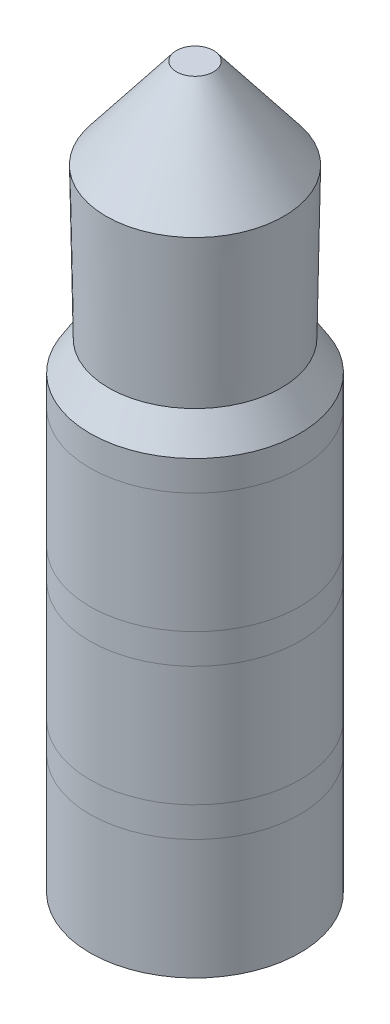
ISO-10303-21;
HEADER;
FILE_DESCRIPTION(('STEP AP214'),'2;1');
FILE_NAME('part.step','',(''),(''),'','','');
FILE_SCHEMA(('AUTOMOTIVE_DESIGN { 1 0 10303 214 1 1 1 1 }'));
ENDSEC;
DATA;
#1=APPLICATION_CONTEXT('core data for automotive mechanical design processes');
#2=APPLICATION_PROTOCOL_DEFINITION('international standard','automotive_design',2000,#1);
#3=PRODUCT_CONTEXT('',#1,'mechanical');
#4=PRODUCT('Part','Part','',(#3));
#5=PRODUCT_RELATED_PRODUCT_CATEGORY('part','',(#4));
#6=PRODUCT_DEFINITION_FORMATION('','',#4);
#7=PRODUCT_DEFINITION_CONTEXT('part definition',#1,'design');
#8=PRODUCT_DEFINITION('design','',#6,#7);
#9=PRODUCT_DEFINITION_SHAPE('','',#8);
#10=(LENGTH_UNIT() NAMED_UNIT(*) SI_UNIT(.MILLI.,.METRE.));
#11=(NAMED_UNIT(*) PLANE_ANGLE_UNIT() SI_UNIT($,.RADIAN.));
#12=(NAMED_UNIT(*) SI_UNIT($,.STERADIAN.) SOLID_ANGLE_UNIT());
#13=UNCERTAINTY_MEASURE_WITH_UNIT(LENGTH_MEASURE(1.E-05),#10,'distance_accuracy_value','');
#14=(GEOMETRIC_REPRESENTATION_CONTEXT(3) GLOBAL_UNCERTAINTY_ASSIGNED_CONTEXT((#13)) GLOBAL_UNIT_ASSIGNED_CONTEXT((#10,
#11,#12)) REPRESENTATION_CONTEXT('',''));
#15=CARTESIAN_POINT('',(0.,0.,0.));
#16=DIRECTION('',(0.,0.,1.));
#17=DIRECTION('',(1.,0.,0.));
#18=AXIS2_PLACEMENT_3D('',#15,#16,#17);
#19=CARTESIAN_POINT('',(0.,7.5,0.));
#20=DIRECTION('',(0.,-1.,0.));
#21=DIRECTION('',(0.,0.,1.));
#22=AXIS2_PLACEMENT_3D('',#19,#20,#21);
#23=CONICAL_SURFACE('',#22,1.75,0.558505360638186);
#24=CARTESIAN_POINT('',(0.,8.,0.));
#25=DIRECTION('',(0.,1.,0.));
#26=DIRECTION('',(0.,0.,1.));
#27=AXIS2_PLACEMENT_3D('',#24,#25,#26);
#28=CIRCLE('',#27,1.43756532404534);
#29=CARTESIAN_POINT('',(0.,8.,1.43756532404534));
#30=VERTEX_POINT('',#29);
#31=EDGE_CURVE('E11',#30,#30,#28,.T.);
#32=ORIENTED_EDGE('',*,*,#31,.F.);
#33=EDGE_LOOP('',(#32));
#34=FACE_BOUND('',#33,.T.);
#35=CARTESIAN_POINT('',(0.,7.5,0.));
#36=DIRECTION('',(0.,1.,0.));
#37=DIRECTION('',(0.,0.,1.));
#38=AXIS2_PLACEMENT_3D('',#35,#36,#37);
#39=CIRCLE('',#38,1.75);
#40=CARTESIAN_POINT('',(0.,7.5,1.75));
#41=VERTEX_POINT('',#40);
#42=EDGE_CURVE('E50',#41,#41,#39,.T.);
#43=ORIENTED_EDGE('',*,*,#42,.T.);
#44=EDGE_LOOP('',(#43));
#45=FACE_BOUND('',#44,.T.);
#46=ADVANCED_FACE('F44',(#34,#45),#23,.T.);
#47=CARTESIAN_POINT('',(0.,7.5,0.));
#48=DIRECTION('',(0.,1.,0.));
#49=DIRECTION('',(0.,0.,1.));
#50=AXIS2_PLACEMENT_3D('',#47,#48,#49);
#51=PLANE('',#50);
#52=ORIENTED_EDGE('',*,*,#42,.F.);
#53=EDGE_LOOP('',(#52));
#54=FACE_BOUND('',#53,.T.);
#55=ADVANCED_FACE('F74',(#54),#51,.F.);
#56=CARTESIAN_POINT('',(0.,8.,0.));
#57=DIRECTION('',(0.,1.,0.));
#58=DIRECTION('',(0.,0.,1.));
#59=AXIS2_PLACEMENT_3D('',#56,#57,#58);
#60=CONICAL_SURFACE('',#59,1.43756532404534,0.0174532925199435);
#61=CARTESIAN_POINT('',(0.,10.5,0.));
#62=DIRECTION('',(0.,1.,0.));
#63=DIRECTION('',(0.,0.,1.));
#64=AXIS2_PLACEMENT_3D('',#61,#62,#63);
#65=CIRCLE('',#64,1.48120298636588);
#66=CARTESIAN_POINT('',(0.,10.5,1.48120298636588));
#67=VERTEX_POINT('',#66);
#68=EDGE_CURVE('E54',#67,#67,#65,.T.);
#69=ORIENTED_EDGE('',*,*,#68,.F.);
#70=EDGE_LOOP('',(#69));
#71=FACE_BOUND('',#70,.T.);
#72=ORIENTED_EDGE('',*,*,#31,.T.);
#73=EDGE_LOOP('',(#72));
#74=FACE_BOUND('',#73,.T.);
#75=ADVANCED_FACE('F69',(#71,#74),#60,.T.);
#76=CARTESIAN_POINT('',(0.,10.5,0.));
#77=DIRECTION('',(0.,-1.,0.));
#78=DIRECTION('',(0.,0.,1.));
#79=AXIS2_PLACEMENT_3D('',#76,#77,#78);
#80=CONICAL_SURFACE('',#79,1.48120298636588,0.663225115757846);
#81=CARTESIAN_POINT('',(0.,12.,0.));
#82=DIRECTION('',(0.,1.,0.));
#83=DIRECTION('',(0.,0.,1.));
#84=AXIS2_PLACEMENT_3D('',#81,#82,#83);
#85=CIRCLE('',#84,0.309274546605803);
#86=CARTESIAN_POINT('',(0.,12.,0.309274546605803));
#87=VERTEX_POINT('',#86);
#88=EDGE_CURVE('E58',#87,#87,#85,.T.);
#89=CARTESIAN_POINT('',(0.,12.,0.309274546605803));
#90=CARTESIAN_POINT('',(0.,11.984375,0.321482134519972));
#91=CARTESIAN_POINT('',(0.,11.96875,0.333689722434139));
#92=CARTESIAN_POINT('',(0.,11.9375,0.358104898262473));
#93=CARTESIAN_POINT('',(0.,11.921875,0.370312486176641));
#94=CARTESIAN_POINT('',(0.,11.890625,0.394727662004975));
#95=CARTESIAN_POINT('',(0.,11.875,0.406935249919143));
#96=CARTESIAN_POINT('',(0.,11.84375,0.431350425747478));
#97=CARTESIAN_POINT('',(0.,11.828125,0.443558013661646));
#98=CARTESIAN_POINT('',(0.,11.796875,0.46797318948998));
#99=CARTESIAN_POINT('',(0.,11.78125,0.480180777404148));
#100=CARTESIAN_POINT('',(0.,11.75,0.504595953232483));
#101=CARTESIAN_POINT('',(0.,11.734375,0.51680354114665));
#102=CARTESIAN_POINT('',(0.,11.703125,0.541218716974985));
#103=CARTESIAN_POINT('',(0.,11.6875,0.553426304889153));
#104=CARTESIAN_POINT('',(0.,11.65625,0.577841480717488));
#105=CARTESIAN_POINT('',(0.,11.640625,0.590049068631655));
#106=CARTESIAN_POINT('',(0.,11.609375,0.61446424445999));
#107=CARTESIAN_POINT('',(0.,11.59375,0.626671832374158));
#108=CARTESIAN_POINT('',(0.,11.5625,0.651087008202493));
#109=CARTESIAN_POINT('',(0.,11.546875,0.66329459611666));
#110=CARTESIAN_POINT('',(0.,11.515625,0.687709771944995));
#111=CARTESIAN_POINT('',(0.,11.5,0.699917359859162));
#112=CARTESIAN_POINT('',(0.,11.46875,0.724332535687497));
#113=CARTESIAN_POINT('',(0.,11.453125,0.736540123601665));
#114=CARTESIAN_POINT('',(0.,11.421875,0.76095529943));
#115=CARTESIAN_POINT('',(0.,11.40625,0.773162887344167));
#116=CARTESIAN_POINT('',(0.,11.375,0.797578063172502));
#117=CARTESIAN_POINT('',(0.,11.359375,0.80978565108667));
#118=CARTESIAN_POINT('',(0.,11.328125,0.834200826915005));
#119=CARTESIAN_POINT('',(0.,11.3125,0.846408414829172));
#120=CARTESIAN_POINT('',(0.,11.28125,0.870823590657507));
#121=CARTESIAN_POINT('',(0.,11.265625,0.883031178571675));
#122=CARTESIAN_POINT('',(0.,11.234375,0.90744635440001));
#123=CARTESIAN_POINT('',(0.,11.21875,0.919653942314177));
#124=CARTESIAN_POINT('',(0.,11.1875,0.944069118142512));
#125=CARTESIAN_POINT('',(0.,11.171875,0.956276706056679));
#126=CARTESIAN_POINT('',(0.,11.140625,0.980691881885014));
#127=CARTESIAN_POINT('',(0.,11.125,0.992899469799182));
#128=CARTESIAN_POINT('',(0.,11.09375,1.01731464562752));
#129=CARTESIAN_POINT('',(0.,11.078125,1.02952223354168));
#130=CARTESIAN_POINT('',(0.,11.046875,1.05393740937002));
#131=CARTESIAN_POINT('',(0.,11.03125,1.06614499728419));
#132=CARTESIAN_POINT('',(0.,11.,1.09056017311252));
#133=CARTESIAN_POINT('',(0.,10.984375,1.10276776102669));
#134=CARTESIAN_POINT('',(0.,10.953125,1.12718293685502));
#135=CARTESIAN_POINT('',(0.,10.9375,1.13939052476919));
#136=CARTESIAN_POINT('',(0.,10.90625,1.16380570059753));
#137=CARTESIAN_POINT('',(0.,10.890625,1.17601328851169));
#138=CARTESIAN_POINT('',(0.,10.859375,1.20042846434003));
#139=CARTESIAN_POINT('',(0.,10.84375,1.2126360522542));
#140=CARTESIAN_POINT('',(0.,10.8125,1.23705122808253));
#141=CARTESIAN_POINT('',(0.,10.796875,1.2492588159967));
#142=CARTESIAN_POINT('',(0.,10.765625,1.27367399182503));
#143=CARTESIAN_POINT('',(0.,10.75,1.2858815797392));
#144=CARTESIAN_POINT('',(0.,10.71875,1.31029675556754));
#145=CARTESIAN_POINT('',(0.,10.703125,1.3225043434817));
#146=CARTESIAN_POINT('',(0.,10.671875,1.34691951931004));
#147=CARTESIAN_POINT('',(0.,10.65625,1.35912710722421));
#148=CARTESIAN_POINT('',(0.,10.625,1.38354228305254));
#149=CARTESIAN_POINT('',(0.,10.609375,1.39574987096671));
#150=CARTESIAN_POINT('',(0.,10.578125,1.42016504679504));
#151=CARTESIAN_POINT('',(0.,10.5625,1.43237263470921));
#152=CARTESIAN_POINT('',(0.,10.53125,1.45678781053755));
#153=CARTESIAN_POINT('',(0.,10.515625,1.46899539845171));
#154=CARTESIAN_POINT('',(0.,10.5,1.48120298636588));
#155=B_SPLINE_CURVE_WITH_KNOTS('',3,(#89,#90,#91,#92,#93,#94,#95,#96,#97,#98,#99,#100,#101,#102,
#103,#104,#105,#106,#107,#108,#109,#110,#111,#112,#113,#114,#115,#116,#117,#118,#119,#120,#121,
#122,#123,#124,#125,#126,#127,#128,#129,#130,#131,#132,#133,#134,#135,#136,#137,#138,#139,#140,
#141,#142,#143,#144,#145,#146,#147,#148,#149,#150,#151,#152,#153,#154),.UNSPECIFIED.,.F.,.F.,(4,
2,2,2,2,2,2,2,2,2,2,2,2,2,2,2,2,2,2,2,2,2,2,2,2,2,2,2,2,2,2,2,4),(0.,0.0594852288315258,
0.118970457663054,0.17845568649458,0.237940915326107,0.297426144157635,0.356911372989162,
0.416396601820689,0.475881830652216,0.535367059483743,0.594852288315271,0.654337517146798,
0.713822745978325,0.773307974809852,0.832793203641379,0.892278432472907,0.951763661304434,
1.01124889013596,1.07073411896749,1.13021934779902,1.18970457663054,1.24918980546207,
1.3086750342936,1.36816026312512,1.42764549195665,1.48713072078818,1.54661594961971,
1.60610117845123,1.66558640728276,1.72507163611429,1.78455686494581,1.84404209377734,
1.90352732260887),.UNSPECIFIED.);
#156=EDGE_CURVE('BSEAM66',#87,#67,#155,.T.);
#157=ORIENTED_EDGE('',*,*,#88,.F.);
#158=ORIENTED_EDGE('',*,*,#68,.T.);
#159=ORIENTED_EDGE('',*,*,#156,.T.);
#160=ORIENTED_EDGE('',*,*,#156,.F.);
#161=EDGE_LOOP('',(#157,#159,#158,#160));
#162=FACE_BOUND('',#161,.T.);
#163=ADVANCED_FACE('F66',(#162),#80,.T.);
#164=CARTESIAN_POINT('',(0.,12.,0.));
#165=DIRECTION('',(0.,1.,0.));
#166=DIRECTION('',(0.,0.,1.));
#167=AXIS2_PLACEMENT_3D('',#164,#165,#166);
#168=PLANE('',#167);
#169=ORIENTED_EDGE('',*,*,#88,.T.);
#170=EDGE_LOOP('',(#169));
#171=FACE_BOUND('',#170,.T.);
#172=ADVANCED_FACE('F64',(#171),#168,.T.);
#173=CLOSED_SHELL('',(#46,#55,#75,#163,#172));
#174=MANIFOLD_SOLID_BREP('B2',#173);
#175=CARTESIAN_POINT('',(0.,7.5,0.));
#176=DIRECTION('',(0.,-1.,0.));
#177=DIRECTION('',(0.,0.,-1.));
#178=AXIS2_PLACEMENT_3D('',#175,#176,#177);
#179=CYLINDRICAL_SURFACE('',#178,1.75);
#180=CARTESIAN_POINT('',(0.,7.5,0.));
#181=DIRECTION('',(0.,1.,0.));
#182=DIRECTION('',(0.,0.,1.));
#183=AXIS2_PLACEMENT_3D('',#180,#181,#182);
#184=CIRCLE('',#183,1.75);
#185=CARTESIAN_POINT('',(0.,7.5,1.75));
#186=VERTEX_POINT('',#185);
#187=EDGE_CURVE('E43',#186,#186,#184,.T.);
#188=ORIENTED_EDGE('',*,*,#187,.F.);
#189=EDGE_LOOP('',(#188));
#190=FACE_BOUND('',#189,.T.);
#191=CARTESIAN_POINT('',(0.,7.,0.));
#192=DIRECTION('',(0.,1.,0.));
#193=DIRECTION('',(0.,0.,1.));
#194=AXIS2_PLACEMENT_3D('',#191,#192,#193);
#195=CIRCLE('',#194,1.75);
#196=CARTESIAN_POINT('',(0.,7.,1.75));
#197=VERTEX_POINT('',#196);
#198=EDGE_CURVE('E134',#197,#197,#195,.T.);
#199=ORIENTED_EDGE('',*,*,#198,.T.);
#200=EDGE_LOOP('',(#199));
#201=FACE_BOUND('',#200,.T.);
#202=ADVANCED_FACE('F131',(#190,#201),#179,.T.);
#203=CARTESIAN_POINT('',(0.,7.5,0.));
#204=DIRECTION('',(0.,1.,0.));
#205=DIRECTION('',(0.,0.,1.));
#206=AXIS2_PLACEMENT_3D('',#203,#204,#205);
#207=PLANE('',#206);
#208=ORIENTED_EDGE('',*,*,#187,.T.);
#209=EDGE_LOOP('',(#208));
#210=FACE_BOUND('',#209,.T.);
#211=ADVANCED_FACE('F146',(#210),#207,.T.);
#212=CARTESIAN_POINT('',(0.,7.,0.));
#213=DIRECTION('',(0.,1.,0.));
#214=DIRECTION('',(0.,0.,1.));
#215=AXIS2_PLACEMENT_3D('',#212,#213,#214);
#216=PLANE('',#215);
#217=ORIENTED_EDGE('',*,*,#198,.F.);
#218=EDGE_LOOP('',(#217));
#219=FACE_BOUND('',#218,.T.);
#220=ADVANCED_FACE('F144',(#219),#216,.F.);
#221=CLOSED_SHELL('',(#202,#211,#220));
#222=MANIFOLD_SOLID_BREP('B6',#221);
#223=CARTESIAN_POINT('',(0.,7.,0.));
#224=DIRECTION('',(0.,-1.,0.));
#225=DIRECTION('',(0.,0.,-1.));
#226=AXIS2_PLACEMENT_3D('',#223,#224,#225);
#227=CYLINDRICAL_SURFACE('',#226,1.75);
#228=CARTESIAN_POINT('',(0.,7.,0.));
#229=DIRECTION('',(0.,1.,0.));
#230=DIRECTION('',(0.,0.,1.));
#231=AXIS2_PLACEMENT_3D('',#228,#229,#230);
#232=CIRCLE('',#231,1.75);
#233=CARTESIAN_POINT('',(0.,7.,1.75));
#234=VERTEX_POINT('',#233);
#235=EDGE_CURVE('E130',#234,#234,#232,.T.);
#236=ORIENTED_EDGE('',*,*,#235,.F.);
#237=EDGE_LOOP('',(#236));
#238=FACE_BOUND('',#237,.T.);
#239=CARTESIAN_POINT('',(0.,5.,0.));
#240=DIRECTION('',(0.,1.,0.));
#241=DIRECTION('',(0.,0.,1.));
#242=AXIS2_PLACEMENT_3D('',#239,#240,#241);
#243=CIRCLE('',#242,1.75);
#244=CARTESIAN_POINT('',(0.,5.,1.75));
#245=VERTEX_POINT('',#244);
#246=EDGE_CURVE('E183',#245,#245,#243,.T.);
#247=ORIENTED_EDGE('',*,*,#246,.T.);
#248=EDGE_LOOP('',(#247));
#249=FACE_BOUND('',#248,.T.);
#250=ADVANCED_FACE('F180',(#238,#249),#227,.T.);
#251=CARTESIAN_POINT('',(0.,7.,0.));
#252=DIRECTION('',(0.,1.,0.));
#253=DIRECTION('',(0.,0.,1.));
#254=AXIS2_PLACEMENT_3D('',#251,#252,#253);
#255=PLANE('',#254);
#256=ORIENTED_EDGE('',*,*,#235,.T.);
#257=EDGE_LOOP('',(#256));
#258=FACE_BOUND('',#257,.T.);
#259=ADVANCED_FACE('F195',(#258),#255,.T.);
#260=CARTESIAN_POINT('',(0.,5.,0.));
#261=DIRECTION('',(0.,1.,0.));
#262=DIRECTION('',(0.,0.,1.));
#263=AXIS2_PLACEMENT_3D('',#260,#261,#262);
#264=PLANE('',#263);
#265=ORIENTED_EDGE('',*,*,#246,.F.);
#266=EDGE_LOOP('',(#265));
#267=FACE_BOUND('',#266,.T.);
#268=ADVANCED_FACE('F193',(#267),#264,.F.);
#269=CLOSED_SHELL('',(#250,#259,#268));
#270=MANIFOLD_SOLID_BREP('B38',#269);
#271=CARTESIAN_POINT('',(0.,5.,0.));
#272=DIRECTION('',(0.,-1.,0.));
#273=DIRECTION('',(0.,0.,-1.));
#274=AXIS2_PLACEMENT_3D('',#271,#272,#273);
#275=CYLINDRICAL_SURFACE('',#274,1.75);
#276=CARTESIAN_POINT('',(0.,5.,0.));
#277=DIRECTION('',(0.,1.,0.));
#278=DIRECTION('',(0.,0.,1.));
#279=AXIS2_PLACEMENT_3D('',#276,#277,#278);
#280=CIRCLE('',#279,1.75);
#281=CARTESIAN_POINT('',(0.,5.,1.75));
#282=VERTEX_POINT('',#281);
#283=EDGE_CURVE('E179',#282,#282,#280,.T.);
#284=ORIENTED_EDGE('',*,*,#283,.F.);
#285=EDGE_LOOP('',(#284));
#286=FACE_BOUND('',#285,.T.);
#287=CARTESIAN_POINT('',(0.,4.5,0.));
#288=DIRECTION('',(0.,1.,0.));
#289=DIRECTION('',(0.,0.,1.));
#290=AXIS2_PLACEMENT_3D('',#287,#288,#289);
#291=CIRCLE('',#290,1.75);
#292=CARTESIAN_POINT('',(0.,4.5,1.75));
#293=VERTEX_POINT('',#292);
#294=EDGE_CURVE('E236',#293,#293,#291,.T.);
#295=ORIENTED_EDGE('',*,*,#294,.T.);
#296=EDGE_LOOP('',(#295));
#297=FACE_BOUND('',#296,.T.);
#298=ADVANCED_FACE('F233',(#286,#297),#275,.T.);
#299=CARTESIAN_POINT('',(0.,5.,0.));
#300=DIRECTION('',(0.,1.,0.));
#301=DIRECTION('',(0.,0.,1.));
#302=AXIS2_PLACEMENT_3D('',#299,#300,#301);
#303=PLANE('',#302);
#304=ORIENTED_EDGE('',*,*,#283,.T.);
#305=EDGE_LOOP('',(#304));
#306=FACE_BOUND('',#305,.T.);
#307=ADVANCED_FACE('F248',(#306),#303,.T.);
#308=CARTESIAN_POINT('',(0.,4.5,0.));
#309=DIRECTION('',(0.,1.,0.));
#310=DIRECTION('',(0.,0.,1.));
#311=AXIS2_PLACEMENT_3D('',#308,#309,#310);
#312=PLANE('',#311);
#313=ORIENTED_EDGE('',*,*,#294,.F.);
#314=EDGE_LOOP('',(#313));
#315=FACE_BOUND('',#314,.T.);
#316=ADVANCED_FACE('F246',(#315),#312,.F.);
#317=CLOSED_SHELL('',(#298,#307,#316));
#318=MANIFOLD_SOLID_BREP('B125',#317);
#319=CARTESIAN_POINT('',(0.,4.5,0.));
#320=DIRECTION('',(0.,-1.,0.));
#321=DIRECTION('',(0.,0.,-1.));
#322=AXIS2_PLACEMENT_3D('',#319,#320,#321);
#323=CYLINDRICAL_SURFACE('',#322,1.75);
#324=CARTESIAN_POINT('',(0.,4.5,0.));
#325=DIRECTION('',(0.,1.,0.));
#326=DIRECTION('',(0.,0.,1.));
#327=AXIS2_PLACEMENT_3D('',#324,#325,#326);
#328=CIRCLE('',#327,1.75);
#329=CARTESIAN_POINT('',(0.,4.5,1.75));
#330=VERTEX_POINT('',#329);
#331=EDGE_CURVE('E232',#330,#330,#328,.T.);
#332=ORIENTED_EDGE('',*,*,#331,.F.);
#333=EDGE_LOOP('',(#332));
#334=FACE_BOUND('',#333,.T.);
#335=CARTESIAN_POINT('',(0.,2.5,0.));
#336=DIRECTION('',(0.,1.,0.));
#337=DIRECTION('',(0.,0.,1.));
#338=AXIS2_PLACEMENT_3D('',#335,#336,#337);
#339=CIRCLE('',#338,1.75);
#340=CARTESIAN_POINT('',(0.,2.5,1.75));
#341=VERTEX_POINT('',#340);
#342=EDGE_CURVE('E285',#341,#341,#339,.T.);
#343=ORIENTED_EDGE('',*,*,#342,.T.);
#344=EDGE_LOOP('',(#343));
#345=FACE_BOUND('',#344,.T.);
#346=ADVANCED_FACE('F282',(#334,#345),#323,.T.);
#347=CARTESIAN_POINT('',(0.,4.5,0.));
#348=DIRECTION('',(0.,1.,0.));
#349=DIRECTION('',(0.,0.,1.));
#350=AXIS2_PLACEMENT_3D('',#347,#348,#349);
#351=PLANE('',#350);
#352=ORIENTED_EDGE('',*,*,#331,.T.);
#353=EDGE_LOOP('',(#352));
#354=FACE_BOUND('',#353,.T.);
#355=ADVANCED_FACE('F297',(#354),#351,.T.);
#356=CARTESIAN_POINT('',(0.,2.5,0.));
#357=DIRECTION('',(0.,1.,0.));
#358=DIRECTION('',(0.,0.,1.));
#359=AXIS2_PLACEMENT_3D('',#356,#357,#358);
#360=PLANE('',#359);
#361=ORIENTED_EDGE('',*,*,#342,.F.);
#362=EDGE_LOOP('',(#361));
#363=FACE_BOUND('',#362,.T.);
#364=ADVANCED_FACE('F295',(#363),#360,.F.);
#365=CLOSED_SHELL('',(#346,#355,#364));
#366=MANIFOLD_SOLID_BREP('B174',#365);
#367=CARTESIAN_POINT('',(0.,2.5,0.));
#368=DIRECTION('',(0.,-1.,0.));
#369=DIRECTION('',(0.,0.,-1.));
#370=AXIS2_PLACEMENT_3D('',#367,#368,#369);
#371=CYLINDRICAL_SURFACE('',#370,1.75);
#372=CARTESIAN_POINT('',(0.,2.5,0.));
#373=DIRECTION('',(0.,1.,0.));
#374=DIRECTION('',(0.,0.,1.));
#375=AXIS2_PLACEMENT_3D('',#372,#373,#374);
#376=CIRCLE('',#375,1.75);
#377=CARTESIAN_POINT('',(0.,2.5,1.75));
#378=VERTEX_POINT('',#377);
#379=EDGE_CURVE('E281',#378,#378,#376,.T.);
#380=ORIENTED_EDGE('',*,*,#379,.F.);
#381=EDGE_LOOP('',(#380));
#382=FACE_BOUND('',#381,.T.);
#383=CARTESIAN_POINT('',(0.,2.,0.));
#384=DIRECTION('',(0.,1.,0.));
#385=DIRECTION('',(0.,0.,1.));
#386=AXIS2_PLACEMENT_3D('',#383,#384,#385);
#387=CIRCLE('',#386,1.75);
#388=CARTESIAN_POINT('',(0.,2.,1.75));
#389=VERTEX_POINT('',#388);
#390=EDGE_CURVE('E335',#389,#389,#387,.T.);
#391=ORIENTED_EDGE('',*,*,#390,.T.);
#392=EDGE_LOOP('',(#391));
#393=FACE_BOUND('',#392,.T.);
#394=ADVANCED_FACE('F332',(#382,#393),#371,.T.);
#395=CARTESIAN_POINT('',(0.,2.5,0.));
#396=DIRECTION('',(0.,1.,0.));
#397=DIRECTION('',(0.,0.,1.));
#398=AXIS2_PLACEMENT_3D('',#395,#396,#397);
#399=PLANE('',#398);
#400=ORIENTED_EDGE('',*,*,#379,.T.);
#401=EDGE_LOOP('',(#400));
#402=FACE_BOUND('',#401,.T.);
#403=ADVANCED_FACE('F347',(#402),#399,.T.);
#404=CARTESIAN_POINT('',(0.,2.,0.));
#405=DIRECTION('',(0.,1.,0.));
#406=DIRECTION('',(0.,0.,1.));
#407=AXIS2_PLACEMENT_3D('',#404,#405,#406);
#408=PLANE('',#407);
#409=ORIENTED_EDGE('',*,*,#390,.F.);
#410=EDGE_LOOP('',(#409));
#411=FACE_BOUND('',#410,.T.);
#412=ADVANCED_FACE('F345',(#411),#408,.F.);
#413=CLOSED_SHELL('',(#394,#403,#412));
#414=MANIFOLD_SOLID_BREP('B227',#413);
#415=CARTESIAN_POINT('',(0.,2.,0.));
#416=DIRECTION('',(0.,-1.,0.));
#417=DIRECTION('',(0.,0.,-1.));
#418=AXIS2_PLACEMENT_3D('',#415,#416,#417);
#419=CYLINDRICAL_SURFACE('',#418,1.75);
#420=CARTESIAN_POINT('',(0.,2.,0.));
#421=DIRECTION('',(0.,1.,0.));
#422=DIRECTION('',(0.,0.,1.));
#423=AXIS2_PLACEMENT_3D('',#420,#421,#422);
#424=CIRCLE('',#423,1.75);
#425=CARTESIAN_POINT('',(0.,2.,1.75));
#426=VERTEX_POINT('',#425);
#427=EDGE_CURVE('E331',#426,#426,#424,.T.);
#428=ORIENTED_EDGE('',*,*,#427,.F.);
#429=EDGE_LOOP('',(#428));
#430=FACE_BOUND('',#429,.T.);
#431=CARTESIAN_POINT('',(0.,0.,0.));
#432=DIRECTION('',(0.,1.,0.));
#433=DIRECTION('',(0.,0.,1.));
#434=AXIS2_PLACEMENT_3D('',#431,#432,#433);
#435=CIRCLE('',#434,1.75);
#436=CARTESIAN_POINT('',(0.,0.,1.75));
#437=VERTEX_POINT('',#436);
#438=EDGE_CURVE('E376',#437,#437,#435,.T.);
#439=ORIENTED_EDGE('',*,*,#438,.T.);
#440=EDGE_LOOP('',(#439));
#441=FACE_BOUND('',#440,.T.);
#442=ADVANCED_FACE('F373',(#430,#441),#419,.T.);
#443=CARTESIAN_POINT('',(0.,2.,0.));
#444=DIRECTION('',(0.,1.,0.));
#445=DIRECTION('',(0.,0.,1.));
#446=AXIS2_PLACEMENT_3D('',#443,#444,#445);
#447=PLANE('',#446);
#448=ORIENTED_EDGE('',*,*,#427,.T.);
#449=EDGE_LOOP('',(#448));
#450=FACE_BOUND('',#449,.T.);
#451=ADVANCED_FACE('F388',(#450),#447,.T.);
#452=CARTESIAN_POINT('',(0.,0.,0.));
#453=DIRECTION('',(0.,1.,0.));
#454=DIRECTION('',(0.,0.,1.));
#455=AXIS2_PLACEMENT_3D('',#452,#453,#454);
#456=PLANE('',#455);
#457=ORIENTED_EDGE('',*,*,#438,.F.);
#458=EDGE_LOOP('',(#457));
#459=FACE_BOUND('',#458,.T.);
#460=ADVANCED_FACE('F386',(#459),#456,.F.);
#461=CLOSED_SHELL('',(#442,#451,#460));
#462=MANIFOLD_SOLID_BREP('B276',#461);
#463=ADVANCED_BREP_SHAPE_REPRESENTATION('',(#18,#174,#222,#270,#318,#366,#414,#462),#14);
#464=SHAPE_DEFINITION_REPRESENTATION(#9,#463);
ENDSEC;
END-ISO-10303-21;
